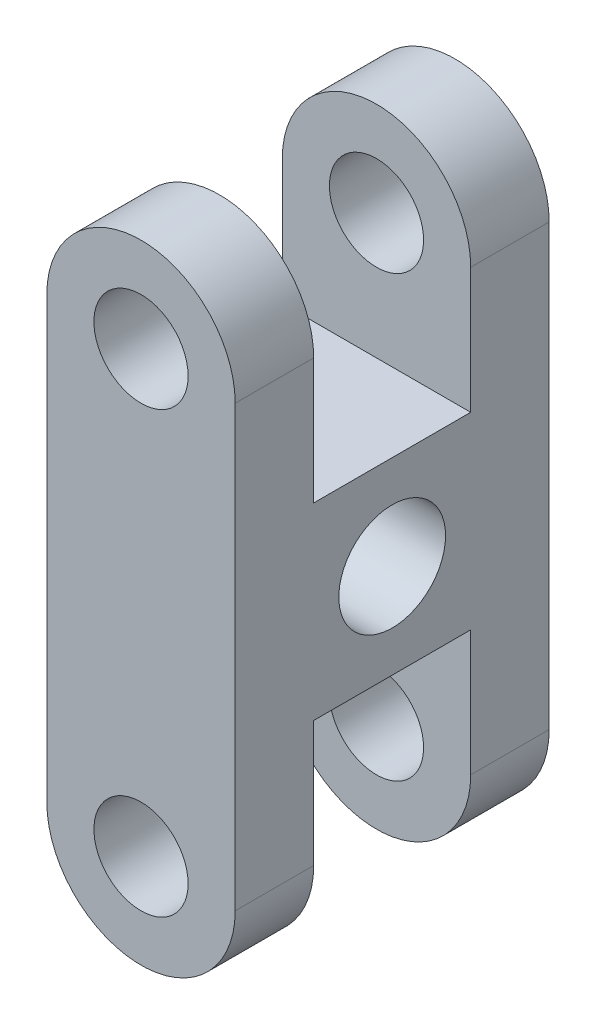
ISO-10303-21;
HEADER;
FILE_DESCRIPTION(('STEP AP214'),'2;1');
FILE_NAME('part.step','',(''),(''),'','','');
FILE_SCHEMA(('AUTOMOTIVE_DESIGN { 1 0 10303 214 1 1 1 1 }'));
ENDSEC;
DATA;
#1=APPLICATION_CONTEXT('core data for automotive mechanical design processes');
#2=APPLICATION_PROTOCOL_DEFINITION('international standard','automotive_design',2000,#1);
#3=PRODUCT_CONTEXT('',#1,'mechanical');
#4=PRODUCT('Part','Part','',(#3));
#5=PRODUCT_RELATED_PRODUCT_CATEGORY('part','',(#4));
#6=PRODUCT_DEFINITION_FORMATION('','',#4);
#7=PRODUCT_DEFINITION_CONTEXT('part definition',#1,'design');
#8=PRODUCT_DEFINITION('design','',#6,#7);
#9=PRODUCT_DEFINITION_SHAPE('','',#8);
#10=(LENGTH_UNIT() NAMED_UNIT(*) SI_UNIT(.MILLI.,.METRE.));
#11=(NAMED_UNIT(*) PLANE_ANGLE_UNIT() SI_UNIT($,.RADIAN.));
#12=(NAMED_UNIT(*) SI_UNIT($,.STERADIAN.) SOLID_ANGLE_UNIT());
#13=UNCERTAINTY_MEASURE_WITH_UNIT(LENGTH_MEASURE(1.E-05),#10,'distance_accuracy_value','');
#14=(GEOMETRIC_REPRESENTATION_CONTEXT(3) GLOBAL_UNCERTAINTY_ASSIGNED_CONTEXT((#13)) GLOBAL_UNIT_ASSIGNED_CONTEXT((#10,
#11,#12)) REPRESENTATION_CONTEXT('',''));
#15=CARTESIAN_POINT('',(0.,0.,0.));
#16=DIRECTION('',(0.,0.,1.));
#17=DIRECTION('',(1.,0.,0.));
#18=AXIS2_PLACEMENT_3D('',#15,#16,#17);
#19=CARTESIAN_POINT('',(0.,-14.,20.));
#20=DIRECTION('',(0.,0.,-1.));
#21=DIRECTION('',(-1.,0.,0.));
#22=AXIS2_PLACEMENT_3D('',#19,#20,#21);
#23=CYLINDRICAL_SURFACE('',#22,6.);
#24=DIRECTION('',(0.,0.,-1.));
#25=VECTOR('',#24,1.);
#26=CARTESIAN_POINT('',(6.,-14.,20.));
#27=LINE('',#26,#25);
#28=CARTESIAN_POINT('',(6.,-14.,5.));
#29=VERTEX_POINT('',#28);
#30=CARTESIAN_POINT('',(6.,-14.,0.));
#31=VERTEX_POINT('',#30);
#32=EDGE_CURVE('E48',#29,#31,#27,.T.);
#33=ORIENTED_EDGE('',*,*,#32,.F.);
#34=CARTESIAN_POINT('',(0.,-14.,5.));
#35=DIRECTION('',(0.,0.,-1.));
#36=DIRECTION('',(0.,1.,0.));
#37=AXIS2_PLACEMENT_3D('',#34,#35,#36);
#38=CIRCLE('',#37,6.);
#39=CARTESIAN_POINT('',(-6.,-14.,5.));
#40=VERTEX_POINT('',#39);
#41=EDGE_CURVE('E134',#29,#40,#38,.T.);
#42=ORIENTED_EDGE('',*,*,#41,.T.);
#43=DIRECTION('',(0.,0.,-1.));
#44=VECTOR('',#43,1.);
#45=CARTESIAN_POINT('',(-6.,-14.,20.));
#46=LINE('',#45,#44);
#47=CARTESIAN_POINT('',(-6.,-14.,0.));
#48=VERTEX_POINT('',#47);
#49=EDGE_CURVE('E221',#40,#48,#46,.T.);
#50=ORIENTED_EDGE('',*,*,#49,.T.);
#51=CARTESIAN_POINT('',(0.,-14.,0.));
#52=DIRECTION('',(0.,0.,1.));
#53=DIRECTION('',(1.,0.,0.));
#54=AXIS2_PLACEMENT_3D('',#51,#52,#53);
#55=CIRCLE('',#54,6.);
#56=EDGE_CURVE('E208',#48,#31,#55,.T.);
#57=ORIENTED_EDGE('',*,*,#56,.T.);
#58=EDGE_LOOP('',(#33,#42,#50,#57));
#59=FACE_BOUND('',#58,.T.);
#60=ADVANCED_FACE('F39',(#59),#23,.T.);
#61=CARTESIAN_POINT('',(6.,-14.,20.));
#62=DIRECTION('',(-1.,0.,0.));
#63=DIRECTION('',(0.,0.,1.));
#64=AXIS2_PLACEMENT_3D('',#61,#62,#63);
#65=PLANE('',#64);
#66=CARTESIAN_POINT('',(6.,0.,10.));
#67=DIRECTION('',(1.,0.,0.));
#68=DIRECTION('',(0.,0.,-1.));
#69=AXIS2_PLACEMENT_3D('',#66,#67,#68);
#70=CIRCLE('',#69,3.4);
#71=CARTESIAN_POINT('',(6.,0.,6.6));
#72=VERTEX_POINT('',#71);
#73=EDGE_CURVE('E166',#72,#72,#70,.T.);
#74=ORIENTED_EDGE('',*,*,#73,.F.);
#75=EDGE_LOOP('',(#74));
#76=FACE_BOUND('',#75,.T.);
#77=DIRECTION('',(0.,-1.,0.));
#78=VECTOR('',#77,1.);
#79=CARTESIAN_POINT('',(6.,20.,15.));
#80=LINE('',#79,#78);
#81=CARTESIAN_POINT('',(6.,14.,15.));
#82=VERTEX_POINT('',#81);
#83=CARTESIAN_POINT('',(6.,5.99999999999999,15.));
#84=VERTEX_POINT('',#83);
#85=EDGE_CURVE('E185',#82,#84,#80,.T.);
#86=ORIENTED_EDGE('',*,*,#85,.F.);
#87=DIRECTION('',(0.,0.,-1.));
#88=VECTOR('',#87,1.);
#89=CARTESIAN_POINT('',(6.,14.,20.));
#90=LINE('',#89,#88);
#91=CARTESIAN_POINT('',(6.,14.,20.));
#92=VERTEX_POINT('',#91);
#93=EDGE_CURVE('E238',#92,#82,#90,.T.);
#94=ORIENTED_EDGE('',*,*,#93,.F.);
#95=DIRECTION('',(0.,1.,0.));
#96=VECTOR('',#95,1.);
#97=CARTESIAN_POINT('',(6.,-14.,20.));
#98=LINE('',#97,#96);
#99=CARTESIAN_POINT('',(6.,-14.,20.));
#100=VERTEX_POINT('',#99);
#101=EDGE_CURVE('E215',#100,#92,#98,.T.);
#102=ORIENTED_EDGE('',*,*,#101,.F.);
#103=CARTESIAN_POINT('',(6.,-14.,15.));
#104=VERTEX_POINT('',#103);
#105=EDGE_CURVE('E11',#100,#104,#27,.T.);
#106=ORIENTED_EDGE('',*,*,#105,.T.);
#107=DIRECTION('',(0.,-1.,0.));
#108=VECTOR('',#107,1.);
#109=CARTESIAN_POINT('',(6.,-20.,15.));
#110=LINE('',#109,#108);
#111=CARTESIAN_POINT('',(6.,-6.,15.));
#112=VERTEX_POINT('',#111);
#113=EDGE_CURVE('E139',#112,#104,#110,.T.);
#114=ORIENTED_EDGE('',*,*,#113,.F.);
#115=DIRECTION('',(0.,0.,1.));
#116=VECTOR('',#115,1.);
#117=CARTESIAN_POINT('',(6.,-6.,15.));
#118=LINE('',#117,#116);
#119=CARTESIAN_POINT('',(6.,-6.,5.));
#120=VERTEX_POINT('',#119);
#121=EDGE_CURVE('E137',#120,#112,#118,.T.);
#122=ORIENTED_EDGE('',*,*,#121,.F.);
#123=DIRECTION('',(0.,1.,0.));
#124=VECTOR('',#123,1.);
#125=CARTESIAN_POINT('',(6.,-6.,5.));
#126=LINE('',#125,#124);
#127=EDGE_CURVE('E129',#29,#120,#126,.T.);
#128=ORIENTED_EDGE('',*,*,#127,.F.);
#129=ORIENTED_EDGE('',*,*,#32,.T.);
#130=DIRECTION('',(0.,1.,0.));
#131=VECTOR('',#130,1.);
#132=CARTESIAN_POINT('',(6.,-14.,0.));
#133=LINE('',#132,#131);
#134=CARTESIAN_POINT('',(6.,14.,0.));
#135=VERTEX_POINT('',#134);
#136=EDGE_CURVE('E222',#31,#135,#133,.T.);
#137=ORIENTED_EDGE('',*,*,#136,.T.);
#138=CARTESIAN_POINT('',(6.,14.,5.));
#139=VERTEX_POINT('',#138);
#140=EDGE_CURVE('E236',#139,#135,#90,.T.);
#141=ORIENTED_EDGE('',*,*,#140,.F.);
#142=DIRECTION('',(0.,1.,0.));
#143=VECTOR('',#142,1.);
#144=CARTESIAN_POINT('',(6.,5.99999999999999,5.));
#145=LINE('',#144,#143);
#146=CARTESIAN_POINT('',(6.,5.99999999999999,5.));
#147=VERTEX_POINT('',#146);
#148=EDGE_CURVE('E176',#147,#139,#145,.T.);
#149=ORIENTED_EDGE('',*,*,#148,.F.);
#150=DIRECTION('',(0.,0.,-1.));
#151=VECTOR('',#150,1.);
#152=CARTESIAN_POINT('',(6.,5.99999999999999,15.));
#153=LINE('',#152,#151);
#154=EDGE_CURVE('E177',#84,#147,#153,.T.);
#155=ORIENTED_EDGE('',*,*,#154,.F.);
#156=EDGE_LOOP('',(#86,#94,#102,#106,#114,#122,#128,#129,#137,#141,#149,#155));
#157=FACE_BOUND('',#156,.T.);
#158=ADVANCED_FACE('F155',(#76,#157),#65,.F.);
#159=CARTESIAN_POINT('',(0.,14.,20.));
#160=DIRECTION('',(0.,0.,-1.));
#161=DIRECTION('',(-1.,0.,0.));
#162=AXIS2_PLACEMENT_3D('',#159,#160,#161);
#163=CYLINDRICAL_SURFACE('',#162,6.);
#164=ORIENTED_EDGE('',*,*,#93,.T.);
#165=CARTESIAN_POINT('',(0.,14.,15.));
#166=DIRECTION('',(0.,0.,1.));
#167=DIRECTION('',(1.,0.,0.));
#168=AXIS2_PLACEMENT_3D('',#165,#166,#167);
#169=CIRCLE('',#168,6.);
#170=CARTESIAN_POINT('',(-6.,14.,15.));
#171=VERTEX_POINT('',#170);
#172=EDGE_CURVE('E195',#82,#171,#169,.T.);
#173=ORIENTED_EDGE('',*,*,#172,.T.);
#174=DIRECTION('',(0.,0.,-1.));
#175=VECTOR('',#174,1.);
#176=CARTESIAN_POINT('',(-6.,14.,20.));
#177=LINE('',#176,#175);
#178=CARTESIAN_POINT('',(-6.,14.,20.));
#179=VERTEX_POINT('',#178);
#180=EDGE_CURVE('E237',#179,#171,#177,.T.);
#181=ORIENTED_EDGE('',*,*,#180,.F.);
#182=CARTESIAN_POINT('',(0.,14.,20.));
#183=DIRECTION('',(0.,0.,1.));
#184=DIRECTION('',(1.,0.,0.));
#185=AXIS2_PLACEMENT_3D('',#182,#183,#184);
#186=CIRCLE('',#185,6.);
#187=EDGE_CURVE('E220',#92,#179,#186,.T.);
#188=ORIENTED_EDGE('',*,*,#187,.F.);
#189=EDGE_LOOP('',(#164,#173,#181,#188));
#190=FACE_BOUND('',#189,.T.);
#191=ADVANCED_FACE('F290',(#190),#163,.T.);
#192=CARTESIAN_POINT('',(0.,-14.,20.));
#193=DIRECTION('',(0.,0.,-1.));
#194=DIRECTION('',(-1.,0.,0.));
#195=AXIS2_PLACEMENT_3D('',#192,#193,#194);
#196=CYLINDRICAL_SURFACE('',#195,3.);
#197=CARTESIAN_POINT('',(0.,-14.,15.));
#198=DIRECTION('',(0.,0.,1.));
#199=DIRECTION('',(1.,0.,0.));
#200=AXIS2_PLACEMENT_3D('',#197,#198,#199);
#201=CIRCLE('',#200,3.);
#202=CARTESIAN_POINT('',(3.,-14.,15.));
#203=VERTEX_POINT('',#202);
#204=EDGE_CURVE('E43',#203,#203,#201,.T.);
#205=ORIENTED_EDGE('',*,*,#204,.F.);
#206=EDGE_LOOP('',(#205));
#207=FACE_BOUND('',#206,.T.);
#208=CARTESIAN_POINT('',(0.,-14.,20.));
#209=DIRECTION('',(0.,0.,1.));
#210=DIRECTION('',(1.,0.,0.));
#211=AXIS2_PLACEMENT_3D('',#208,#209,#210);
#212=CIRCLE('',#211,3.);
#213=CARTESIAN_POINT('',(3.,-14.,20.));
#214=VERTEX_POINT('',#213);
#215=EDGE_CURVE('E203',#214,#214,#212,.T.);
#216=ORIENTED_EDGE('',*,*,#215,.T.);
#217=EDGE_LOOP('',(#216));
#218=FACE_BOUND('',#217,.T.);
#219=ADVANCED_FACE('F258',(#207,#218),#196,.F.);
#220=CARTESIAN_POINT('',(0.,14.,20.));
#221=DIRECTION('',(0.,0.,-1.));
#222=DIRECTION('',(-1.,0.,0.));
#223=AXIS2_PLACEMENT_3D('',#220,#221,#222);
#224=CYLINDRICAL_SURFACE('',#223,3.);
#225=CARTESIAN_POINT('',(0.,14.,15.));
#226=DIRECTION('',(0.,0.,1.));
#227=DIRECTION('',(1.,0.,0.));
#228=AXIS2_PLACEMENT_3D('',#225,#226,#227);
#229=CIRCLE('',#228,3.);
#230=CARTESIAN_POINT('',(3.,14.,15.));
#231=VERTEX_POINT('',#230);
#232=EDGE_CURVE('E192',#231,#231,#229,.T.);
#233=ORIENTED_EDGE('',*,*,#232,.F.);
#234=EDGE_LOOP('',(#233));
#235=FACE_BOUND('',#234,.T.);
#236=CARTESIAN_POINT('',(0.,14.,20.));
#237=DIRECTION('',(0.,0.,1.));
#238=DIRECTION('',(1.,0.,0.));
#239=AXIS2_PLACEMENT_3D('',#236,#237,#238);
#240=CIRCLE('',#239,3.);
#241=CARTESIAN_POINT('',(3.,14.,20.));
#242=VERTEX_POINT('',#241);
#243=EDGE_CURVE('E199',#242,#242,#240,.T.);
#244=ORIENTED_EDGE('',*,*,#243,.T.);
#245=EDGE_LOOP('',(#244));
#246=FACE_BOUND('',#245,.T.);
#247=ADVANCED_FACE('F271',(#235,#246),#224,.F.);
#248=CARTESIAN_POINT('',(0.,-14.,20.));
#249=DIRECTION('',(0.,0.,1.));
#250=DIRECTION('',(1.,0.,0.));
#251=AXIS2_PLACEMENT_3D('',#248,#249,#250);
#252=PLANE('',#251);
#253=ORIENTED_EDGE('',*,*,#215,.F.);
#254=EDGE_LOOP('',(#253));
#255=FACE_BOUND('',#254,.T.);
#256=CARTESIAN_POINT('',(0.,-14.,20.));
#257=DIRECTION('',(0.,0.,1.));
#258=DIRECTION('',(1.,0.,0.));
#259=AXIS2_PLACEMENT_3D('',#256,#257,#258);
#260=CIRCLE('',#259,6.);
#261=CARTESIAN_POINT('',(-6.,-14.,20.));
#262=VERTEX_POINT('',#261);
#263=EDGE_CURVE('E213',#262,#100,#260,.T.);
#264=ORIENTED_EDGE('',*,*,#263,.T.);
#265=ORIENTED_EDGE('',*,*,#101,.T.);
#266=ORIENTED_EDGE('',*,*,#187,.T.);
#267=DIRECTION('',(0.,-1.,0.));
#268=VECTOR('',#267,1.);
#269=CARTESIAN_POINT('',(-6.,-14.,20.));
#270=LINE('',#269,#268);
#271=EDGE_CURVE('E219',#179,#262,#270,.T.);
#272=ORIENTED_EDGE('',*,*,#271,.T.);
#273=EDGE_LOOP('',(#264,#265,#266,#272));
#274=FACE_BOUND('',#273,.T.);
#275=ORIENTED_EDGE('',*,*,#243,.F.);
#276=EDGE_LOOP('',(#275));
#277=FACE_BOUND('',#276,.T.);
#278=ADVANCED_FACE('F265',(#255,#274,#277),#252,.T.);
#279=CARTESIAN_POINT('',(0.,-14.,0.));
#280=DIRECTION('',(0.,0.,1.));
#281=DIRECTION('',(1.,0.,0.));
#282=AXIS2_PLACEMENT_3D('',#279,#280,#281);
#283=PLANE('',#282);
#284=ORIENTED_EDGE('',*,*,#56,.F.);
#285=DIRECTION('',(0.,-1.,0.));
#286=VECTOR('',#285,1.);
#287=CARTESIAN_POINT('',(-6.,-14.,0.));
#288=LINE('',#287,#286);
#289=CARTESIAN_POINT('',(-6.,14.,0.));
#290=VERTEX_POINT('',#289);
#291=EDGE_CURVE('E214',#290,#48,#288,.T.);
#292=ORIENTED_EDGE('',*,*,#291,.F.);
#293=CARTESIAN_POINT('',(0.,14.,0.));
#294=DIRECTION('',(0.,0.,1.));
#295=DIRECTION('',(1.,0.,0.));
#296=AXIS2_PLACEMENT_3D('',#293,#294,#295);
#297=CIRCLE('',#296,6.);
#298=EDGE_CURVE('E230',#135,#290,#297,.T.);
#299=ORIENTED_EDGE('',*,*,#298,.F.);
#300=ORIENTED_EDGE('',*,*,#136,.F.);
#301=EDGE_LOOP('',(#284,#292,#299,#300));
#302=FACE_BOUND('',#301,.T.);
#303=CARTESIAN_POINT('',(0.,-14.,0.));
#304=DIRECTION('',(0.,0.,1.));
#305=DIRECTION('',(1.,0.,0.));
#306=AXIS2_PLACEMENT_3D('',#303,#304,#305);
#307=CIRCLE('',#306,3.);
#308=CARTESIAN_POINT('',(3.,-14.,0.));
#309=VERTEX_POINT('',#308);
#310=EDGE_CURVE('E205',#309,#309,#307,.T.);
#311=ORIENTED_EDGE('',*,*,#310,.T.);
#312=EDGE_LOOP('',(#311));
#313=FACE_BOUND('',#312,.T.);
#314=CARTESIAN_POINT('',(0.,14.,0.));
#315=DIRECTION('',(0.,0.,1.));
#316=DIRECTION('',(1.,0.,0.));
#317=AXIS2_PLACEMENT_3D('',#314,#315,#316);
#318=CIRCLE('',#317,3.);
#319=CARTESIAN_POINT('',(3.,14.,0.));
#320=VERTEX_POINT('',#319);
#321=EDGE_CURVE('E198',#320,#320,#318,.T.);
#322=ORIENTED_EDGE('',*,*,#321,.T.);
#323=EDGE_LOOP('',(#322));
#324=FACE_BOUND('',#323,.T.);
#325=ADVANCED_FACE('F260',(#302,#313,#324),#283,.F.);
#326=CARTESIAN_POINT('',(-6.,-14.,15.));
#327=VERTEX_POINT('',#326);
#328=EDGE_CURVE('E235',#262,#327,#46,.T.);
#329=ORIENTED_EDGE('',*,*,#328,.T.);
#330=CARTESIAN_POINT('',(0.,-14.,15.));
#331=DIRECTION('',(0.,0.,1.));
#332=DIRECTION('',(1.,0.,0.));
#333=AXIS2_PLACEMENT_3D('',#330,#331,#332);
#334=CIRCLE('',#333,6.);
#335=EDGE_CURVE('E197',#327,#104,#334,.T.);
#336=ORIENTED_EDGE('',*,*,#335,.T.);
#337=ORIENTED_EDGE('',*,*,#105,.F.);
#338=ORIENTED_EDGE('',*,*,#263,.F.);
#339=EDGE_LOOP('',(#329,#336,#337,#338));
#340=FACE_BOUND('',#339,.T.);
#341=ADVANCED_FACE('F41',(#340),#23,.T.);
#342=CARTESIAN_POINT('',(0.,14.,5.));
#343=DIRECTION('',(0.,0.,-1.));
#344=DIRECTION('',(0.,1.,0.));
#345=AXIS2_PLACEMENT_3D('',#342,#343,#344);
#346=CIRCLE('',#345,6.);
#347=CARTESIAN_POINT('',(-6.,14.,5.));
#348=VERTEX_POINT('',#347);
#349=EDGE_CURVE('E188',#348,#139,#346,.T.);
#350=ORIENTED_EDGE('',*,*,#349,.T.);
#351=ORIENTED_EDGE('',*,*,#140,.T.);
#352=ORIENTED_EDGE('',*,*,#298,.T.);
#353=EDGE_CURVE('E234',#348,#290,#177,.T.);
#354=ORIENTED_EDGE('',*,*,#353,.F.);
#355=EDGE_LOOP('',(#350,#351,#352,#354));
#356=FACE_BOUND('',#355,.T.);
#357=ADVANCED_FACE('F286',(#356),#163,.T.);
#358=CARTESIAN_POINT('',(-6.,-14.,20.));
#359=DIRECTION('',(1.,0.,0.));
#360=DIRECTION('',(0.,0.,-1.));
#361=AXIS2_PLACEMENT_3D('',#358,#359,#360);
#362=PLANE('',#361);
#363=DIRECTION('',(0.,0.,1.));
#364=VECTOR('',#363,1.);
#365=CARTESIAN_POINT('',(-6.,-6.,15.));
#366=LINE('',#365,#364);
#367=CARTESIAN_POINT('',(-6.,-6.,5.));
#368=VERTEX_POINT('',#367);
#369=CARTESIAN_POINT('',(-6.,-6.,15.));
#370=VERTEX_POINT('',#369);
#371=EDGE_CURVE('E150',#368,#370,#366,.T.);
#372=ORIENTED_EDGE('',*,*,#371,.T.);
#373=DIRECTION('',(0.,-1.,0.));
#374=VECTOR('',#373,1.);
#375=CARTESIAN_POINT('',(-6.,-20.,15.));
#376=LINE('',#375,#374);
#377=EDGE_CURVE('E57',#370,#327,#376,.T.);
#378=ORIENTED_EDGE('',*,*,#377,.T.);
#379=ORIENTED_EDGE('',*,*,#328,.F.);
#380=ORIENTED_EDGE('',*,*,#271,.F.);
#381=ORIENTED_EDGE('',*,*,#180,.T.);
#382=DIRECTION('',(0.,-1.,0.));
#383=VECTOR('',#382,1.);
#384=CARTESIAN_POINT('',(-6.,20.,15.));
#385=LINE('',#384,#383);
#386=CARTESIAN_POINT('',(-6.,5.99999999999999,15.));
#387=VERTEX_POINT('',#386);
#388=EDGE_CURVE('E171',#171,#387,#385,.T.);
#389=ORIENTED_EDGE('',*,*,#388,.T.);
#390=DIRECTION('',(0.,0.,-1.));
#391=VECTOR('',#390,1.);
#392=CARTESIAN_POINT('',(-6.,5.99999999999999,15.));
#393=LINE('',#392,#391);
#394=CARTESIAN_POINT('',(-6.,5.99999999999999,5.));
#395=VERTEX_POINT('',#394);
#396=EDGE_CURVE('E169',#387,#395,#393,.T.);
#397=ORIENTED_EDGE('',*,*,#396,.T.);
#398=DIRECTION('',(0.,1.,0.));
#399=VECTOR('',#398,1.);
#400=CARTESIAN_POINT('',(-6.,5.99999999999999,5.));
#401=LINE('',#400,#399);
#402=EDGE_CURVE('E64',#395,#348,#401,.T.);
#403=ORIENTED_EDGE('',*,*,#402,.T.);
#404=ORIENTED_EDGE('',*,*,#353,.T.);
#405=ORIENTED_EDGE('',*,*,#291,.T.);
#406=ORIENTED_EDGE('',*,*,#49,.F.);
#407=DIRECTION('',(0.,1.,0.));
#408=VECTOR('',#407,1.);
#409=CARTESIAN_POINT('',(-6.,-6.,5.));
#410=LINE('',#409,#408);
#411=EDGE_CURVE('E151',#40,#368,#410,.T.);
#412=ORIENTED_EDGE('',*,*,#411,.T.);
#413=EDGE_LOOP('',(#372,#378,#379,#380,#381,#389,#397,#403,#404,#405,#406,#412));
#414=FACE_BOUND('',#413,.T.);
#415=CARTESIAN_POINT('',(-6.,0.,10.));
#416=DIRECTION('',(1.,0.,0.));
#417=DIRECTION('',(0.,0.,-1.));
#418=AXIS2_PLACEMENT_3D('',#415,#416,#417);
#419=CIRCLE('',#418,3.4);
#420=CARTESIAN_POINT('',(-6.,0.,6.6));
#421=VERTEX_POINT('',#420);
#422=EDGE_CURVE('E182',#421,#421,#419,.T.);
#423=ORIENTED_EDGE('',*,*,#422,.T.);
#424=EDGE_LOOP('',(#423));
#425=FACE_BOUND('',#424,.T.);
#426=ADVANCED_FACE('F254',(#414,#425),#362,.F.);
#427=CARTESIAN_POINT('',(0.,-14.,5.));
#428=DIRECTION('',(0.,0.,-1.));
#429=DIRECTION('',(0.,1.,0.));
#430=AXIS2_PLACEMENT_3D('',#427,#428,#429);
#431=CIRCLE('',#430,3.);
#432=CARTESIAN_POINT('',(0.,-11.,5.));
#433=VERTEX_POINT('',#432);
#434=EDGE_CURVE('E191',#433,#433,#431,.T.);
#435=ORIENTED_EDGE('',*,*,#434,.F.);
#436=EDGE_LOOP('',(#435));
#437=FACE_BOUND('',#436,.T.);
#438=ORIENTED_EDGE('',*,*,#310,.F.);
#439=EDGE_LOOP('',(#438));
#440=FACE_BOUND('',#439,.T.);
#441=ADVANCED_FACE('F248',(#437,#440),#196,.F.);
#442=CARTESIAN_POINT('',(0.,14.,5.));
#443=DIRECTION('',(0.,0.,-1.));
#444=DIRECTION('',(0.,1.,0.));
#445=AXIS2_PLACEMENT_3D('',#442,#443,#444);
#446=CIRCLE('',#445,3.);
#447=CARTESIAN_POINT('',(0.,17.,5.));
#448=VERTEX_POINT('',#447);
#449=EDGE_CURVE('E162',#448,#448,#446,.T.);
#450=ORIENTED_EDGE('',*,*,#449,.F.);
#451=EDGE_LOOP('',(#450));
#452=FACE_BOUND('',#451,.T.);
#453=ORIENTED_EDGE('',*,*,#321,.F.);
#454=EDGE_LOOP('',(#453));
#455=FACE_BOUND('',#454,.T.);
#456=ADVANCED_FACE('F253',(#452,#455),#224,.F.);
#457=CARTESIAN_POINT('',(-6.,20.,15.));
#458=DIRECTION('',(0.,0.,1.));
#459=DIRECTION('',(1.,0.,0.));
#460=AXIS2_PLACEMENT_3D('',#457,#458,#459);
#461=PLANE('',#460);
#462=ORIENTED_EDGE('',*,*,#232,.T.);
#463=EDGE_LOOP('',(#462));
#464=FACE_BOUND('',#463,.T.);
#465=ORIENTED_EDGE('',*,*,#85,.T.);
#466=DIRECTION('',(1.,0.,0.));
#467=VECTOR('',#466,1.);
#468=CARTESIAN_POINT('',(-6.,5.99999999999999,15.));
#469=LINE('',#468,#467);
#470=EDGE_CURVE('E163',#387,#84,#469,.T.);
#471=ORIENTED_EDGE('',*,*,#470,.F.);
#472=ORIENTED_EDGE('',*,*,#388,.F.);
#473=ORIENTED_EDGE('',*,*,#172,.F.);
#474=EDGE_LOOP('',(#465,#471,#472,#473));
#475=FACE_BOUND('',#474,.T.);
#476=ADVANCED_FACE('F268',(#464,#475),#461,.F.);
#477=CARTESIAN_POINT('',(-6.,5.99999999999999,5.));
#478=DIRECTION('',(0.,0.,-1.));
#479=DIRECTION('',(0.,1.,0.));
#480=AXIS2_PLACEMENT_3D('',#477,#478,#479);
#481=PLANE('',#480);
#482=ORIENTED_EDGE('',*,*,#449,.T.);
#483=EDGE_LOOP('',(#482));
#484=FACE_BOUND('',#483,.T.);
#485=ORIENTED_EDGE('',*,*,#349,.F.);
#486=ORIENTED_EDGE('',*,*,#402,.F.);
#487=DIRECTION('',(1.,0.,0.));
#488=VECTOR('',#487,1.);
#489=CARTESIAN_POINT('',(-6.,5.99999999999999,5.));
#490=LINE('',#489,#488);
#491=EDGE_CURVE('E168',#395,#147,#490,.T.);
#492=ORIENTED_EDGE('',*,*,#491,.T.);
#493=ORIENTED_EDGE('',*,*,#148,.T.);
#494=EDGE_LOOP('',(#485,#486,#492,#493));
#495=FACE_BOUND('',#494,.T.);
#496=ADVANCED_FACE('F274',(#484,#495),#481,.F.);
#497=CARTESIAN_POINT('',(-6.,5.99999999999999,15.));
#498=DIRECTION('',(0.,-1.,0.));
#499=DIRECTION('',(0.,0.,-1.));
#500=AXIS2_PLACEMENT_3D('',#497,#498,#499);
#501=PLANE('',#500);
#502=ORIENTED_EDGE('',*,*,#491,.F.);
#503=ORIENTED_EDGE('',*,*,#396,.F.);
#504=ORIENTED_EDGE('',*,*,#470,.T.);
#505=ORIENTED_EDGE('',*,*,#154,.T.);
#506=EDGE_LOOP('',(#502,#503,#504,#505));
#507=FACE_BOUND('',#506,.T.);
#508=ADVANCED_FACE('F312',(#507),#501,.F.);
#509=CARTESIAN_POINT('',(-6.,-20.,15.));
#510=DIRECTION('',(0.,0.,1.));
#511=DIRECTION('',(1.,0.,0.));
#512=AXIS2_PLACEMENT_3D('',#509,#510,#511);
#513=PLANE('',#512);
#514=ORIENTED_EDGE('',*,*,#204,.T.);
#515=EDGE_LOOP('',(#514));
#516=FACE_BOUND('',#515,.T.);
#517=ORIENTED_EDGE('',*,*,#377,.F.);
#518=DIRECTION('',(1.,0.,0.));
#519=VECTOR('',#518,1.);
#520=CARTESIAN_POINT('',(-6.,-6.,15.));
#521=LINE('',#520,#519);
#522=EDGE_CURVE('E146',#370,#112,#521,.T.);
#523=ORIENTED_EDGE('',*,*,#522,.T.);
#524=ORIENTED_EDGE('',*,*,#113,.T.);
#525=ORIENTED_EDGE('',*,*,#335,.F.);
#526=EDGE_LOOP('',(#517,#523,#524,#525));
#527=FACE_BOUND('',#526,.T.);
#528=ADVANCED_FACE('F399',(#516,#527),#513,.F.);
#529=CARTESIAN_POINT('',(-6.,-6.,5.));
#530=DIRECTION('',(0.,0.,-1.));
#531=DIRECTION('',(0.,1.,0.));
#532=AXIS2_PLACEMENT_3D('',#529,#530,#531);
#533=PLANE('',#532);
#534=ORIENTED_EDGE('',*,*,#434,.T.);
#535=EDGE_LOOP('',(#534));
#536=FACE_BOUND('',#535,.T.);
#537=ORIENTED_EDGE('',*,*,#127,.T.);
#538=DIRECTION('',(1.,0.,0.));
#539=VECTOR('',#538,1.);
#540=CARTESIAN_POINT('',(-6.,-6.,5.));
#541=LINE('',#540,#539);
#542=EDGE_CURVE('E133',#368,#120,#541,.T.);
#543=ORIENTED_EDGE('',*,*,#542,.F.);
#544=ORIENTED_EDGE('',*,*,#411,.F.);
#545=ORIENTED_EDGE('',*,*,#41,.F.);
#546=EDGE_LOOP('',(#537,#543,#544,#545));
#547=FACE_BOUND('',#546,.T.);
#548=ADVANCED_FACE('F131',(#536,#547),#533,.F.);
#549=CARTESIAN_POINT('',(-6.,-6.,15.));
#550=DIRECTION('',(0.,1.,0.));
#551=DIRECTION('',(0.,0.,1.));
#552=AXIS2_PLACEMENT_3D('',#549,#550,#551);
#553=PLANE('',#552);
#554=ORIENTED_EDGE('',*,*,#522,.F.);
#555=ORIENTED_EDGE('',*,*,#371,.F.);
#556=ORIENTED_EDGE('',*,*,#542,.T.);
#557=ORIENTED_EDGE('',*,*,#121,.T.);
#558=EDGE_LOOP('',(#554,#555,#556,#557));
#559=FACE_BOUND('',#558,.T.);
#560=ADVANCED_FACE('F143',(#559),#553,.F.);
#561=CARTESIAN_POINT('',(-6.,0.,10.));
#562=DIRECTION('',(1.,0.,0.));
#563=DIRECTION('',(0.,0.,-1.));
#564=AXIS2_PLACEMENT_3D('',#561,#562,#563);
#565=CYLINDRICAL_SURFACE('',#564,3.4);
#566=ORIENTED_EDGE('',*,*,#422,.F.);
#567=EDGE_LOOP('',(#566));
#568=FACE_BOUND('',#567,.T.);
#569=ORIENTED_EDGE('',*,*,#73,.T.);
#570=EDGE_LOOP('',(#569));
#571=FACE_BOUND('',#570,.T.);
#572=ADVANCED_FACE('F421',(#568,#571),#565,.F.);
#573=CLOSED_SHELL('',(#60,#158,#191,#219,#247,#278,#325,#341,#357,#426,#441,#456,#476,#496,#508,
#528,#548,#560,#572));
#574=MANIFOLD_SOLID_BREP('B2',#573);
#575=ADVANCED_BREP_SHAPE_REPRESENTATION('',(#18,#574),#14);
#576=SHAPE_DEFINITION_REPRESENTATION(#9,#575);
ENDSEC;
END-ISO-10303-21;
